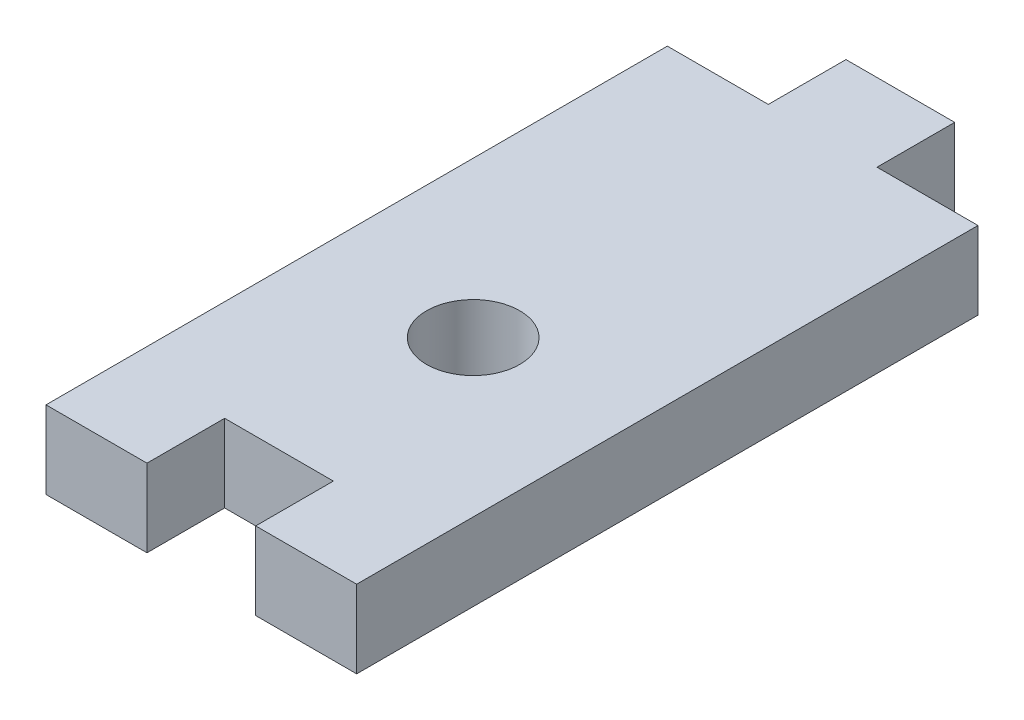
ISO-10303-21;
HEADER;
FILE_DESCRIPTION(('STEP AP214'),'2;1');
FILE_NAME('part.step','',(''),(''),'','','');
FILE_SCHEMA(('AUTOMOTIVE_DESIGN { 1 0 10303 214 1 1 1 1 }'));
ENDSEC;
DATA;
#1=APPLICATION_CONTEXT('core data for automotive mechanical design processes');
#2=APPLICATION_PROTOCOL_DEFINITION('international standard','automotive_design',2000,#1);
#3=PRODUCT_CONTEXT('',#1,'mechanical');
#4=PRODUCT('Part','Part','',(#3));
#5=PRODUCT_RELATED_PRODUCT_CATEGORY('part','',(#4));
#6=PRODUCT_DEFINITION_FORMATION('','',#4);
#7=PRODUCT_DEFINITION_CONTEXT('part definition',#1,'design');
#8=PRODUCT_DEFINITION('design','',#6,#7);
#9=PRODUCT_DEFINITION_SHAPE('','',#8);
#10=(LENGTH_UNIT() NAMED_UNIT(*) SI_UNIT(.MILLI.,.METRE.));
#11=(NAMED_UNIT(*) PLANE_ANGLE_UNIT() SI_UNIT($,.RADIAN.));
#12=(NAMED_UNIT(*) SI_UNIT($,.STERADIAN.) SOLID_ANGLE_UNIT());
#13=UNCERTAINTY_MEASURE_WITH_UNIT(LENGTH_MEASURE(1.E-05),#10,'distance_accuracy_value','');
#14=(GEOMETRIC_REPRESENTATION_CONTEXT(3) GLOBAL_UNCERTAINTY_ASSIGNED_CONTEXT((#13)) GLOBAL_UNIT_ASSIGNED_CONTEXT((#10,
#11,#12)) REPRESENTATION_CONTEXT('',''));
#15=CARTESIAN_POINT('',(0.,0.,0.));
#16=DIRECTION('',(0.,0.,1.));
#17=DIRECTION('',(1.,0.,0.));
#18=AXIS2_PLACEMENT_3D('',#15,#16,#17);
#19=CARTESIAN_POINT('',(-3.49999999999999,5.,-20.));
#20=DIRECTION('',(0.,0.,1.));
#21=DIRECTION('',(1.,0.,0.));
#22=AXIS2_PLACEMENT_3D('',#19,#20,#21);
#23=PLANE('',#22);
#24=DIRECTION('',(-1.,0.,0.));
#25=VECTOR('',#24,1.);
#26=CARTESIAN_POINT('',(-3.49999999999999,0.,-20.));
#27=LINE('',#26,#25);
#28=CARTESIAN_POINT('',(-3.49999999999999,0.,-20.));
#29=VERTEX_POINT('',#28);
#30=CARTESIAN_POINT('',(-10.,0.,-20.));
#31=VERTEX_POINT('',#30);
#32=EDGE_CURVE('E162',#29,#31,#27,.T.);
#33=ORIENTED_EDGE('',*,*,#32,.T.);
#34=DIRECTION('',(0.,-1.,0.));
#35=VECTOR('',#34,1.);
#36=CARTESIAN_POINT('',(-10.,5.,-20.));
#37=LINE('',#36,#35);
#38=CARTESIAN_POINT('',(-10.,5.,-20.));
#39=VERTEX_POINT('',#38);
#40=EDGE_CURVE('E11',#39,#31,#37,.T.);
#41=ORIENTED_EDGE('',*,*,#40,.F.);
#42=DIRECTION('',(-1.,0.,0.));
#43=VECTOR('',#42,1.);
#44=CARTESIAN_POINT('',(-3.49999999999999,5.,-20.));
#45=LINE('',#44,#43);
#46=CARTESIAN_POINT('',(-3.49999999999999,5.,-20.));
#47=VERTEX_POINT('',#46);
#48=EDGE_CURVE('E184',#47,#39,#45,.T.);
#49=ORIENTED_EDGE('',*,*,#48,.F.);
#50=DIRECTION('',(0.,-1.,0.));
#51=VECTOR('',#50,1.);
#52=CARTESIAN_POINT('',(-3.49999999999999,5.,-20.));
#53=LINE('',#52,#51);
#54=EDGE_CURVE('E158',#47,#29,#53,.T.);
#55=ORIENTED_EDGE('',*,*,#54,.T.);
#56=EDGE_LOOP('',(#33,#41,#49,#55));
#57=FACE_BOUND('',#56,.T.);
#58=ADVANCED_FACE('F41',(#57),#23,.F.);
#59=CARTESIAN_POINT('',(-10.,5.,-20.));
#60=DIRECTION('',(1.,0.,0.));
#61=DIRECTION('',(0.,0.,-1.));
#62=AXIS2_PLACEMENT_3D('',#59,#60,#61);
#63=PLANE('',#62);
#64=DIRECTION('',(0.,0.,1.));
#65=VECTOR('',#64,1.);
#66=CARTESIAN_POINT('',(-10.,0.,-20.));
#67=LINE('',#66,#65);
#68=CARTESIAN_POINT('',(-10.,0.,20.));
#69=VERTEX_POINT('',#68);
#70=EDGE_CURVE('E165',#31,#69,#67,.T.);
#71=ORIENTED_EDGE('',*,*,#70,.T.);
#72=DIRECTION('',(0.,-1.,0.));
#73=VECTOR('',#72,1.);
#74=CARTESIAN_POINT('',(-10.,5.,20.));
#75=LINE('',#74,#73);
#76=CARTESIAN_POINT('',(-10.,5.,20.));
#77=VERTEX_POINT('',#76);
#78=EDGE_CURVE('E50',#77,#69,#75,.T.);
#79=ORIENTED_EDGE('',*,*,#78,.F.);
#80=DIRECTION('',(0.,0.,1.));
#81=VECTOR('',#80,1.);
#82=CARTESIAN_POINT('',(-10.,5.,-20.));
#83=LINE('',#82,#81);
#84=EDGE_CURVE('E113',#39,#77,#83,.T.);
#85=ORIENTED_EDGE('',*,*,#84,.F.);
#86=ORIENTED_EDGE('',*,*,#40,.T.);
#87=EDGE_LOOP('',(#71,#79,#85,#86));
#88=FACE_BOUND('',#87,.T.);
#89=ADVANCED_FACE('F264',(#88),#63,.F.);
#90=CARTESIAN_POINT('',(-10.,5.,20.));
#91=DIRECTION('',(0.,0.,-1.));
#92=DIRECTION('',(-1.,0.,0.));
#93=AXIS2_PLACEMENT_3D('',#90,#91,#92);
#94=PLANE('',#93);
#95=DIRECTION('',(1.,0.,0.));
#96=VECTOR('',#95,1.);
#97=CARTESIAN_POINT('',(-10.,0.,20.));
#98=LINE('',#97,#96);
#99=CARTESIAN_POINT('',(-3.49999999999999,0.,20.));
#100=VERTEX_POINT('',#99);
#101=EDGE_CURVE('E167',#69,#100,#98,.T.);
#102=ORIENTED_EDGE('',*,*,#101,.T.);
#103=DIRECTION('',(0.,-1.,0.));
#104=VECTOR('',#103,1.);
#105=CARTESIAN_POINT('',(-3.49999999999999,5.,20.));
#106=LINE('',#105,#104);
#107=CARTESIAN_POINT('',(-3.49999999999999,5.,20.));
#108=VERTEX_POINT('',#107);
#109=EDGE_CURVE('E203',#108,#100,#106,.T.);
#110=ORIENTED_EDGE('',*,*,#109,.F.);
#111=DIRECTION('',(1.,0.,0.));
#112=VECTOR('',#111,1.);
#113=CARTESIAN_POINT('',(-10.,5.,20.));
#114=LINE('',#113,#112);
#115=EDGE_CURVE('E212',#77,#108,#114,.T.);
#116=ORIENTED_EDGE('',*,*,#115,.F.);
#117=ORIENTED_EDGE('',*,*,#78,.T.);
#118=EDGE_LOOP('',(#102,#110,#116,#117));
#119=FACE_BOUND('',#118,.T.);
#120=ADVANCED_FACE('F210',(#119),#94,.F.);
#121=CARTESIAN_POINT('',(-3.49999999999999,5.,20.));
#122=DIRECTION('',(-1.,0.,0.));
#123=DIRECTION('',(0.,0.,1.));
#124=AXIS2_PLACEMENT_3D('',#121,#122,#123);
#125=PLANE('',#124);
#126=DIRECTION('',(0.,0.,-1.));
#127=VECTOR('',#126,1.);
#128=CARTESIAN_POINT('',(-3.49999999999999,0.,20.));
#129=LINE('',#128,#127);
#130=CARTESIAN_POINT('',(-3.49999999999999,0.,15.));
#131=VERTEX_POINT('',#130);
#132=EDGE_CURVE('E169',#100,#131,#129,.T.);
#133=ORIENTED_EDGE('',*,*,#132,.T.);
#134=DIRECTION('',(0.,-1.,0.));
#135=VECTOR('',#134,1.);
#136=CARTESIAN_POINT('',(-3.49999999999999,5.,15.));
#137=LINE('',#136,#135);
#138=CARTESIAN_POINT('',(-3.49999999999999,5.,15.));
#139=VERTEX_POINT('',#138);
#140=EDGE_CURVE('E200',#139,#131,#137,.T.);
#141=ORIENTED_EDGE('',*,*,#140,.F.);
#142=DIRECTION('',(0.,0.,-1.));
#143=VECTOR('',#142,1.);
#144=CARTESIAN_POINT('',(-3.49999999999999,5.,20.));
#145=LINE('',#144,#143);
#146=EDGE_CURVE('E230',#108,#139,#145,.T.);
#147=ORIENTED_EDGE('',*,*,#146,.F.);
#148=ORIENTED_EDGE('',*,*,#109,.T.);
#149=EDGE_LOOP('',(#133,#141,#147,#148));
#150=FACE_BOUND('',#149,.T.);
#151=ADVANCED_FACE('F221',(#150),#125,.F.);
#152=CARTESIAN_POINT('',(-3.49999999999999,5.,15.));
#153=DIRECTION('',(0.,0.,-1.));
#154=DIRECTION('',(-1.,0.,0.));
#155=AXIS2_PLACEMENT_3D('',#152,#153,#154);
#156=PLANE('',#155);
#157=DIRECTION('',(1.,0.,0.));
#158=VECTOR('',#157,1.);
#159=CARTESIAN_POINT('',(-3.49999999999999,0.,15.));
#160=LINE('',#159,#158);
#161=CARTESIAN_POINT('',(3.49999999999999,0.,15.));
#162=VERTEX_POINT('',#161);
#163=EDGE_CURVE('E171',#131,#162,#160,.T.);
#164=ORIENTED_EDGE('',*,*,#163,.T.);
#165=DIRECTION('',(0.,-1.,0.));
#166=VECTOR('',#165,1.);
#167=CARTESIAN_POINT('',(3.49999999999999,5.,15.));
#168=LINE('',#167,#166);
#169=CARTESIAN_POINT('',(3.49999999999999,5.,15.));
#170=VERTEX_POINT('',#169);
#171=EDGE_CURVE('E197',#170,#162,#168,.T.);
#172=ORIENTED_EDGE('',*,*,#171,.F.);
#173=DIRECTION('',(1.,0.,0.));
#174=VECTOR('',#173,1.);
#175=CARTESIAN_POINT('',(-3.49999999999999,5.,15.));
#176=LINE('',#175,#174);
#177=EDGE_CURVE('E227',#139,#170,#176,.T.);
#178=ORIENTED_EDGE('',*,*,#177,.F.);
#179=ORIENTED_EDGE('',*,*,#140,.T.);
#180=EDGE_LOOP('',(#164,#172,#178,#179));
#181=FACE_BOUND('',#180,.T.);
#182=ADVANCED_FACE('F225',(#181),#156,.F.);
#183=CARTESIAN_POINT('',(3.49999999999999,5.,15.));
#184=DIRECTION('',(1.,0.,0.));
#185=DIRECTION('',(0.,0.,-1.));
#186=AXIS2_PLACEMENT_3D('',#183,#184,#185);
#187=PLANE('',#186);
#188=DIRECTION('',(0.,0.,1.));
#189=VECTOR('',#188,1.);
#190=CARTESIAN_POINT('',(3.49999999999999,0.,15.));
#191=LINE('',#190,#189);
#192=CARTESIAN_POINT('',(3.49999999999999,0.,20.));
#193=VERTEX_POINT('',#192);
#194=EDGE_CURVE('E173',#162,#193,#191,.T.);
#195=ORIENTED_EDGE('',*,*,#194,.T.);
#196=DIRECTION('',(0.,-1.,0.));
#197=VECTOR('',#196,1.);
#198=CARTESIAN_POINT('',(3.49999999999999,5.,20.));
#199=LINE('',#198,#197);
#200=CARTESIAN_POINT('',(3.49999999999999,5.,20.));
#201=VERTEX_POINT('',#200);
#202=EDGE_CURVE('E194',#201,#193,#199,.T.);
#203=ORIENTED_EDGE('',*,*,#202,.F.);
#204=DIRECTION('',(0.,0.,1.));
#205=VECTOR('',#204,1.);
#206=CARTESIAN_POINT('',(3.49999999999999,5.,15.));
#207=LINE('',#206,#205);
#208=EDGE_CURVE('E229',#170,#201,#207,.T.);
#209=ORIENTED_EDGE('',*,*,#208,.F.);
#210=ORIENTED_EDGE('',*,*,#171,.T.);
#211=EDGE_LOOP('',(#195,#203,#209,#210));
#212=FACE_BOUND('',#211,.T.);
#213=ADVANCED_FACE('F277',(#212),#187,.F.);
#214=CARTESIAN_POINT('',(3.49999999999999,5.,20.));
#215=DIRECTION('',(0.,0.,-1.));
#216=DIRECTION('',(-1.,0.,0.));
#217=AXIS2_PLACEMENT_3D('',#214,#215,#216);
#218=PLANE('',#217);
#219=DIRECTION('',(1.,0.,0.));
#220=VECTOR('',#219,1.);
#221=CARTESIAN_POINT('',(3.49999999999999,0.,20.));
#222=LINE('',#221,#220);
#223=CARTESIAN_POINT('',(10.,0.,20.));
#224=VERTEX_POINT('',#223);
#225=EDGE_CURVE('E175',#193,#224,#222,.T.);
#226=ORIENTED_EDGE('',*,*,#225,.T.);
#227=DIRECTION('',(0.,-1.,0.));
#228=VECTOR('',#227,1.);
#229=CARTESIAN_POINT('',(10.,5.,20.));
#230=LINE('',#229,#228);
#231=CARTESIAN_POINT('',(10.,5.,20.));
#232=VERTEX_POINT('',#231);
#233=EDGE_CURVE('E191',#232,#224,#230,.T.);
#234=ORIENTED_EDGE('',*,*,#233,.F.);
#235=DIRECTION('',(1.,0.,0.));
#236=VECTOR('',#235,1.);
#237=CARTESIAN_POINT('',(3.49999999999999,5.,20.));
#238=LINE('',#237,#236);
#239=EDGE_CURVE('E232',#201,#232,#238,.T.);
#240=ORIENTED_EDGE('',*,*,#239,.F.);
#241=ORIENTED_EDGE('',*,*,#202,.T.);
#242=EDGE_LOOP('',(#226,#234,#240,#241));
#243=FACE_BOUND('',#242,.T.);
#244=ADVANCED_FACE('F280',(#243),#218,.F.);
#245=CARTESIAN_POINT('',(10.,5.,20.));
#246=DIRECTION('',(-1.,0.,0.));
#247=DIRECTION('',(0.,0.,1.));
#248=AXIS2_PLACEMENT_3D('',#245,#246,#247);
#249=PLANE('',#248);
#250=DIRECTION('',(0.,0.,-1.));
#251=VECTOR('',#250,1.);
#252=CARTESIAN_POINT('',(10.,0.,20.));
#253=LINE('',#252,#251);
#254=CARTESIAN_POINT('',(10.,0.,-20.));
#255=VERTEX_POINT('',#254);
#256=EDGE_CURVE('E177',#224,#255,#253,.T.);
#257=ORIENTED_EDGE('',*,*,#256,.T.);
#258=DIRECTION('',(0.,-1.,0.));
#259=VECTOR('',#258,1.);
#260=CARTESIAN_POINT('',(10.,5.,-20.));
#261=LINE('',#260,#259);
#262=CARTESIAN_POINT('',(10.,5.,-20.));
#263=VERTEX_POINT('',#262);
#264=EDGE_CURVE('E188',#263,#255,#261,.T.);
#265=ORIENTED_EDGE('',*,*,#264,.F.);
#266=DIRECTION('',(0.,0.,-1.));
#267=VECTOR('',#266,1.);
#268=CARTESIAN_POINT('',(10.,5.,20.));
#269=LINE('',#268,#267);
#270=EDGE_CURVE('E238',#232,#263,#269,.T.);
#271=ORIENTED_EDGE('',*,*,#270,.F.);
#272=ORIENTED_EDGE('',*,*,#233,.T.);
#273=EDGE_LOOP('',(#257,#265,#271,#272));
#274=FACE_BOUND('',#273,.T.);
#275=ADVANCED_FACE('F244',(#274),#249,.F.);
#276=CARTESIAN_POINT('',(10.,5.,-20.));
#277=DIRECTION('',(0.,0.,1.));
#278=DIRECTION('',(1.,0.,0.));
#279=AXIS2_PLACEMENT_3D('',#276,#277,#278);
#280=PLANE('',#279);
#281=DIRECTION('',(-1.,0.,0.));
#282=VECTOR('',#281,1.);
#283=CARTESIAN_POINT('',(10.,0.,-20.));
#284=LINE('',#283,#282);
#285=CARTESIAN_POINT('',(3.49999999999999,0.,-20.));
#286=VERTEX_POINT('',#285);
#287=EDGE_CURVE('E179',#255,#286,#284,.T.);
#288=ORIENTED_EDGE('',*,*,#287,.T.);
#289=DIRECTION('',(0.,-1.,0.));
#290=VECTOR('',#289,1.);
#291=CARTESIAN_POINT('',(3.49999999999999,5.,-20.));
#292=LINE('',#291,#290);
#293=CARTESIAN_POINT('',(3.49999999999999,5.,-20.));
#294=VERTEX_POINT('',#293);
#295=EDGE_CURVE('E153',#294,#286,#292,.T.);
#296=ORIENTED_EDGE('',*,*,#295,.F.);
#297=DIRECTION('',(-1.,0.,0.));
#298=VECTOR('',#297,1.);
#299=CARTESIAN_POINT('',(10.,5.,-20.));
#300=LINE('',#299,#298);
#301=EDGE_CURVE('E144',#263,#294,#300,.T.);
#302=ORIENTED_EDGE('',*,*,#301,.F.);
#303=ORIENTED_EDGE('',*,*,#264,.T.);
#304=EDGE_LOOP('',(#288,#296,#302,#303));
#305=FACE_BOUND('',#304,.T.);
#306=ADVANCED_FACE('F248',(#305),#280,.F.);
#307=CARTESIAN_POINT('',(3.49999999999999,5.,-20.));
#308=DIRECTION('',(-1.,0.,0.));
#309=DIRECTION('',(0.,0.,1.));
#310=AXIS2_PLACEMENT_3D('',#307,#308,#309);
#311=PLANE('',#310);
#312=DIRECTION('',(0.,0.,-1.));
#313=VECTOR('',#312,1.);
#314=CARTESIAN_POINT('',(3.49999999999999,0.,-20.));
#315=LINE('',#314,#313);
#316=CARTESIAN_POINT('',(3.5,0.,-25.));
#317=VERTEX_POINT('',#316);
#318=EDGE_CURVE('E152',#286,#317,#315,.T.);
#319=ORIENTED_EDGE('',*,*,#318,.T.);
#320=DIRECTION('',(0.,-1.,0.));
#321=VECTOR('',#320,1.);
#322=CARTESIAN_POINT('',(3.5,5.,-25.));
#323=LINE('',#322,#321);
#324=CARTESIAN_POINT('',(3.5,5.,-25.));
#325=VERTEX_POINT('',#324);
#326=EDGE_CURVE('E149',#325,#317,#323,.T.);
#327=ORIENTED_EDGE('',*,*,#326,.F.);
#328=DIRECTION('',(0.,0.,-1.));
#329=VECTOR('',#328,1.);
#330=CARTESIAN_POINT('',(3.49999999999999,5.,-20.));
#331=LINE('',#330,#329);
#332=EDGE_CURVE('E138',#294,#325,#331,.T.);
#333=ORIENTED_EDGE('',*,*,#332,.F.);
#334=ORIENTED_EDGE('',*,*,#295,.T.);
#335=EDGE_LOOP('',(#319,#327,#333,#334));
#336=FACE_BOUND('',#335,.T.);
#337=ADVANCED_FACE('F150',(#336),#311,.F.);
#338=CARTESIAN_POINT('',(3.5,5.,-25.));
#339=DIRECTION('',(0.,0.,1.));
#340=DIRECTION('',(1.,0.,0.));
#341=AXIS2_PLACEMENT_3D('',#338,#339,#340);
#342=PLANE('',#341);
#343=DIRECTION('',(-1.,0.,0.));
#344=VECTOR('',#343,1.);
#345=CARTESIAN_POINT('',(3.5,0.,-25.));
#346=LINE('',#345,#344);
#347=CARTESIAN_POINT('',(-3.5,0.,-25.));
#348=VERTEX_POINT('',#347);
#349=EDGE_CURVE('E99',#317,#348,#346,.T.);
#350=ORIENTED_EDGE('',*,*,#349,.T.);
#351=DIRECTION('',(0.,-1.,0.));
#352=VECTOR('',#351,1.);
#353=CARTESIAN_POINT('',(-3.5,5.,-25.));
#354=LINE('',#353,#352);
#355=CARTESIAN_POINT('',(-3.5,5.,-25.));
#356=VERTEX_POINT('',#355);
#357=EDGE_CURVE('E154',#356,#348,#354,.T.);
#358=ORIENTED_EDGE('',*,*,#357,.F.);
#359=DIRECTION('',(-1.,0.,0.));
#360=VECTOR('',#359,1.);
#361=CARTESIAN_POINT('',(3.5,5.,-25.));
#362=LINE('',#361,#360);
#363=EDGE_CURVE('E142',#325,#356,#362,.T.);
#364=ORIENTED_EDGE('',*,*,#363,.F.);
#365=ORIENTED_EDGE('',*,*,#326,.T.);
#366=EDGE_LOOP('',(#350,#358,#364,#365));
#367=FACE_BOUND('',#366,.T.);
#368=ADVANCED_FACE('F156',(#367),#342,.F.);
#369=CARTESIAN_POINT('',(-3.5,5.,-25.));
#370=DIRECTION('',(1.,0.,0.));
#371=DIRECTION('',(0.,0.,-1.));
#372=AXIS2_PLACEMENT_3D('',#369,#370,#371);
#373=PLANE('',#372);
#374=DIRECTION('',(0.,0.,1.));
#375=VECTOR('',#374,1.);
#376=CARTESIAN_POINT('',(-3.5,0.,-25.));
#377=LINE('',#376,#375);
#378=EDGE_CURVE('E105',#348,#29,#377,.T.);
#379=ORIENTED_EDGE('',*,*,#378,.T.);
#380=ORIENTED_EDGE('',*,*,#54,.F.);
#381=DIRECTION('',(0.,0.,1.));
#382=VECTOR('',#381,1.);
#383=CARTESIAN_POINT('',(-3.5,5.,-25.));
#384=LINE('',#383,#382);
#385=EDGE_CURVE('E58',#356,#47,#384,.T.);
#386=ORIENTED_EDGE('',*,*,#385,.F.);
#387=ORIENTED_EDGE('',*,*,#357,.T.);
#388=EDGE_LOOP('',(#379,#380,#386,#387));
#389=FACE_BOUND('',#388,.T.);
#390=ADVANCED_FACE('F252',(#389),#373,.F.);
#391=CARTESIAN_POINT('',(0.,5.,0.));
#392=DIRECTION('',(0.,1.,0.));
#393=DIRECTION('',(0.,0.,1.));
#394=AXIS2_PLACEMENT_3D('',#391,#392,#393);
#395=PLANE('',#394);
#396=CARTESIAN_POINT('',(0.,5.,2.5));
#397=DIRECTION('',(0.,1.,0.));
#398=DIRECTION('',(0.,0.,1.));
#399=AXIS2_PLACEMENT_3D('',#396,#397,#398);
#400=CIRCLE('',#399,3.);
#401=CARTESIAN_POINT('',(0.,5.,5.5));
#402=VERTEX_POINT('',#401);
#403=EDGE_CURVE('E333',#402,#402,#400,.T.);
#404=ORIENTED_EDGE('',*,*,#403,.F.);
#405=EDGE_LOOP('',(#404));
#406=FACE_BOUND('',#405,.T.);
#407=ORIENTED_EDGE('',*,*,#48,.T.);
#408=ORIENTED_EDGE('',*,*,#84,.T.);
#409=ORIENTED_EDGE('',*,*,#115,.T.);
#410=ORIENTED_EDGE('',*,*,#146,.T.);
#411=ORIENTED_EDGE('',*,*,#177,.T.);
#412=ORIENTED_EDGE('',*,*,#208,.T.);
#413=ORIENTED_EDGE('',*,*,#239,.T.);
#414=ORIENTED_EDGE('',*,*,#270,.T.);
#415=ORIENTED_EDGE('',*,*,#301,.T.);
#416=ORIENTED_EDGE('',*,*,#332,.T.);
#417=ORIENTED_EDGE('',*,*,#363,.T.);
#418=ORIENTED_EDGE('',*,*,#385,.T.);
#419=EDGE_LOOP('',(#407,#408,#409,#410,#411,#412,#413,#414,#415,#416,#417,#418));
#420=FACE_BOUND('',#419,.T.);
#421=ADVANCED_FACE('F140',(#406,#420),#395,.T.);
#422=CARTESIAN_POINT('',(0.,0.,0.));
#423=DIRECTION('',(0.,1.,0.));
#424=DIRECTION('',(0.,0.,1.));
#425=AXIS2_PLACEMENT_3D('',#422,#423,#424);
#426=PLANE('',#425);
#427=CARTESIAN_POINT('',(0.,0.,2.5));
#428=DIRECTION('',(0.,1.,0.));
#429=DIRECTION('',(0.,0.,1.));
#430=AXIS2_PLACEMENT_3D('',#427,#428,#429);
#431=CIRCLE('',#430,3.);
#432=CARTESIAN_POINT('',(0.,0.,5.5));
#433=VERTEX_POINT('',#432);
#434=EDGE_CURVE('E44',#433,#433,#431,.T.);
#435=ORIENTED_EDGE('',*,*,#434,.T.);
#436=EDGE_LOOP('',(#435));
#437=FACE_BOUND('',#436,.T.);
#438=ORIENTED_EDGE('',*,*,#32,.F.);
#439=ORIENTED_EDGE('',*,*,#378,.F.);
#440=ORIENTED_EDGE('',*,*,#349,.F.);
#441=ORIENTED_EDGE('',*,*,#318,.F.);
#442=ORIENTED_EDGE('',*,*,#287,.F.);
#443=ORIENTED_EDGE('',*,*,#256,.F.);
#444=ORIENTED_EDGE('',*,*,#225,.F.);
#445=ORIENTED_EDGE('',*,*,#194,.F.);
#446=ORIENTED_EDGE('',*,*,#163,.F.);
#447=ORIENTED_EDGE('',*,*,#132,.F.);
#448=ORIENTED_EDGE('',*,*,#101,.F.);
#449=ORIENTED_EDGE('',*,*,#70,.F.);
#450=EDGE_LOOP('',(#438,#439,#440,#441,#442,#443,#444,#445,#446,#447,#448,#449));
#451=FACE_BOUND('',#450,.T.);
#452=ADVANCED_FACE('F216',(#437,#451),#426,.F.);
#453=CARTESIAN_POINT('',(0.,-5.,2.5));
#454=DIRECTION('',(0.,1.,0.));
#455=DIRECTION('',(0.,0.,1.));
#456=AXIS2_PLACEMENT_3D('',#453,#454,#455);
#457=CYLINDRICAL_SURFACE('',#456,3.);
#458=ORIENTED_EDGE('',*,*,#403,.T.);
#459=EDGE_LOOP('',(#458));
#460=FACE_BOUND('',#459,.T.);
#461=ORIENTED_EDGE('',*,*,#434,.F.);
#462=EDGE_LOOP('',(#461));
#463=FACE_BOUND('',#462,.T.);
#464=ADVANCED_FACE('F317',(#460,#463),#457,.F.);
#465=CLOSED_SHELL('',(#58,#89,#120,#151,#182,#213,#244,#275,#306,#337,#368,#390,#421,#452,#464));
#466=MANIFOLD_SOLID_BREP('B2',#465);
#467=ADVANCED_BREP_SHAPE_REPRESENTATION('',(#18,#466),#14);
#468=SHAPE_DEFINITION_REPRESENTATION(#9,#467);
ENDSEC;
END-ISO-10303-21;
